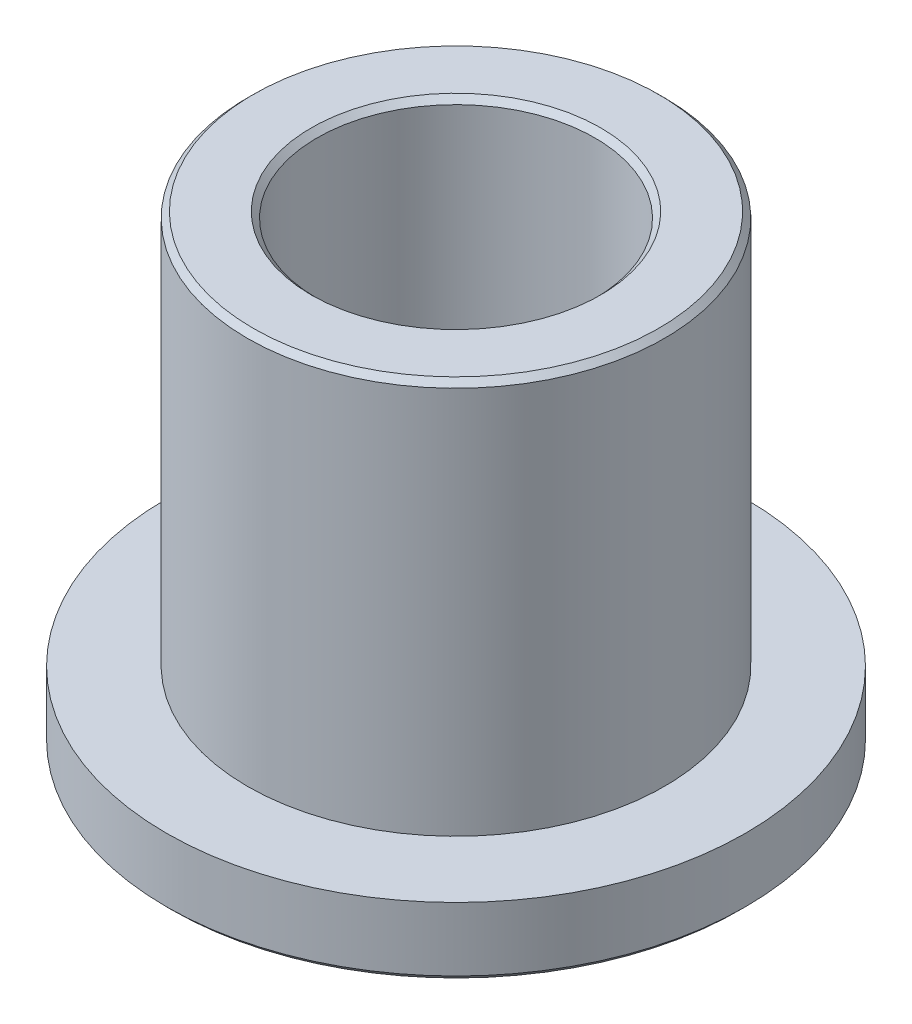
ISO-10303-21;
HEADER;
FILE_DESCRIPTION(('STEP AP214'),'2;1');
FILE_NAME('part.step','',(''),(''),'','','');
FILE_SCHEMA(('AUTOMOTIVE_DESIGN { 1 0 10303 214 1 1 1 1 }'));
ENDSEC;
DATA;
#1=APPLICATION_CONTEXT('core data for automotive mechanical design processes');
#2=APPLICATION_PROTOCOL_DEFINITION('international standard','automotive_design',2000,#1);
#3=PRODUCT_CONTEXT('',#1,'mechanical');
#4=PRODUCT('Part','Part','',(#3));
#5=PRODUCT_RELATED_PRODUCT_CATEGORY('part','',(#4));
#6=PRODUCT_DEFINITION_FORMATION('','',#4);
#7=PRODUCT_DEFINITION_CONTEXT('part definition',#1,'design');
#8=PRODUCT_DEFINITION('design','',#6,#7);
#9=PRODUCT_DEFINITION_SHAPE('','',#8);
#10=(LENGTH_UNIT() NAMED_UNIT(*) SI_UNIT(.MILLI.,.METRE.));
#11=(NAMED_UNIT(*) PLANE_ANGLE_UNIT() SI_UNIT($,.RADIAN.));
#12=(NAMED_UNIT(*) SI_UNIT($,.STERADIAN.) SOLID_ANGLE_UNIT());
#13=UNCERTAINTY_MEASURE_WITH_UNIT(LENGTH_MEASURE(1.E-05),#10,'distance_accuracy_value','');
#14=(GEOMETRIC_REPRESENTATION_CONTEXT(3) GLOBAL_UNCERTAINTY_ASSIGNED_CONTEXT((#13)) GLOBAL_UNIT_ASSIGNED_CONTEXT((#10,
#11,#12)) REPRESENTATION_CONTEXT('',''));
#15=CARTESIAN_POINT('',(0.,0.,0.));
#16=DIRECTION('',(0.,0.,1.));
#17=DIRECTION('',(1.,0.,0.));
#18=AXIS2_PLACEMENT_3D('',#15,#16,#17);
#19=CARTESIAN_POINT('',(0.,3.,0.));
#20=DIRECTION('',(0.,1.,0.));
#21=DIRECTION('',(0.,0.,1.));
#22=AXIS2_PLACEMENT_3D('',#19,#20,#21);
#23=PLANE('',#22);
#24=CARTESIAN_POINT('',(0.,3.,0.));
#25=DIRECTION('',(0.,1.,0.));
#26=DIRECTION('',(0.,0.,1.));
#27=AXIS2_PLACEMENT_3D('',#24,#25,#26);
#28=CIRCLE('',#27,12.5);
#29=CARTESIAN_POINT('',(0.,3.,12.5));
#30=VERTEX_POINT('',#29);
#31=EDGE_CURVE('E83',#30,#30,#28,.T.);
#32=ORIENTED_EDGE('',*,*,#31,.T.);
#33=EDGE_LOOP('',(#32));
#34=FACE_BOUND('',#33,.T.);
#35=CARTESIAN_POINT('',(0.,3.,0.));
#36=DIRECTION('',(0.,1.,0.));
#37=DIRECTION('',(0.,0.,1.));
#38=AXIS2_PLACEMENT_3D('',#35,#36,#37);
#39=CIRCLE('',#38,9.);
#40=CARTESIAN_POINT('',(0.,3.,9.));
#41=VERTEX_POINT('',#40);
#42=EDGE_CURVE('E87',#41,#41,#39,.T.);
#43=ORIENTED_EDGE('',*,*,#42,.F.);
#44=EDGE_LOOP('',(#43));
#45=FACE_BOUND('',#44,.T.);
#46=ADVANCED_FACE('F40',(#34,#45),#23,.T.);
#47=CARTESIAN_POINT('',(0.,0.,0.));
#48=DIRECTION('',(0.,1.,0.));
#49=DIRECTION('',(0.,0.,1.));
#50=AXIS2_PLACEMENT_3D('',#47,#48,#49);
#51=PLANE('',#50);
#52=CARTESIAN_POINT('',(0.,0.,0.));
#53=DIRECTION('',(0.,1.,0.));
#54=DIRECTION('',(0.,0.,1.));
#55=AXIS2_PLACEMENT_3D('',#52,#53,#54);
#56=CIRCLE('',#55,6.25);
#57=CARTESIAN_POINT('',(0.,0.,6.25));
#58=VERTEX_POINT('',#57);
#59=EDGE_CURVE('E75',#58,#58,#56,.T.);
#60=ORIENTED_EDGE('',*,*,#59,.T.);
#61=EDGE_LOOP('',(#60));
#62=FACE_BOUND('',#61,.T.);
#63=CARTESIAN_POINT('',(0.,0.,0.));
#64=DIRECTION('',(0.,1.,0.));
#65=DIRECTION('',(0.,0.,1.));
#66=AXIS2_PLACEMENT_3D('',#63,#64,#65);
#67=CIRCLE('',#66,12.25);
#68=CARTESIAN_POINT('',(0.,0.,12.25));
#69=VERTEX_POINT('',#68);
#70=EDGE_CURVE('E79',#69,#69,#67,.F.);
#71=ORIENTED_EDGE('',*,*,#70,.T.);
#72=EDGE_LOOP('',(#71));
#73=FACE_BOUND('',#72,.T.);
#74=ADVANCED_FACE('F96',(#62,#73),#51,.F.);
#75=CARTESIAN_POINT('',(0.,3.,0.));
#76=DIRECTION('',(0.,-1.,0.));
#77=DIRECTION('',(0.,0.,-1.));
#78=AXIS2_PLACEMENT_3D('',#75,#76,#77);
#79=CYLINDRICAL_SURFACE('',#78,12.5);
#80=CARTESIAN_POINT('',(0.,0.250000000000002,0.));
#81=DIRECTION('',(0.,1.,0.));
#82=DIRECTION('',(0.,0.,1.));
#83=AXIS2_PLACEMENT_3D('',#80,#81,#82);
#84=CIRCLE('',#83,12.5);
#85=CARTESIAN_POINT('',(0.,0.250000000000002,12.5));
#86=VERTEX_POINT('',#85);
#87=EDGE_CURVE('E61',#86,#86,#84,.T.);
#88=ORIENTED_EDGE('',*,*,#87,.T.);
#89=EDGE_LOOP('',(#88));
#90=FACE_BOUND('',#89,.T.);
#91=ORIENTED_EDGE('',*,*,#31,.F.);
#92=EDGE_LOOP('',(#91));
#93=FACE_BOUND('',#92,.T.);
#94=ADVANCED_FACE('F102',(#90,#93),#79,.T.);
#95=CARTESIAN_POINT('',(0.,3.,0.));
#96=DIRECTION('',(0.,-1.,0.));
#97=DIRECTION('',(0.,0.,-1.));
#98=AXIS2_PLACEMENT_3D('',#95,#96,#97);
#99=CYLINDRICAL_SURFACE('',#98,6.);
#100=CARTESIAN_POINT('',(0.,0.25,0.));
#101=DIRECTION('',(0.,1.,0.));
#102=DIRECTION('',(0.,0.,1.));
#103=AXIS2_PLACEMENT_3D('',#100,#101,#102);
#104=CIRCLE('',#103,6.);
#105=CARTESIAN_POINT('',(0.,0.25,6.));
#106=VERTEX_POINT('',#105);
#107=EDGE_CURVE('E67',#106,#106,#104,.F.);
#108=ORIENTED_EDGE('',*,*,#107,.T.);
#109=EDGE_LOOP('',(#108));
#110=FACE_BOUND('',#109,.T.);
#111=CARTESIAN_POINT('',(0.,19.75,0.));
#112=DIRECTION('',(0.,1.,0.));
#113=DIRECTION('',(0.,0.,1.));
#114=AXIS2_PLACEMENT_3D('',#111,#112,#113);
#115=CIRCLE('',#114,6.);
#116=CARTESIAN_POINT('',(0.,19.75,6.));
#117=VERTEX_POINT('',#116);
#118=EDGE_CURVE('E71',#117,#117,#115,.T.);
#119=ORIENTED_EDGE('',*,*,#118,.T.);
#120=EDGE_LOOP('',(#119));
#121=FACE_BOUND('',#120,.T.);
#122=ADVANCED_FACE('F106',(#110,#121),#99,.F.);
#123=CARTESIAN_POINT('',(0.,20.,0.));
#124=DIRECTION('',(0.,1.,0.));
#125=DIRECTION('',(0.,0.,1.));
#126=AXIS2_PLACEMENT_3D('',#123,#124,#125);
#127=PLANE('',#126);
#128=CARTESIAN_POINT('',(0.,20.,0.));
#129=DIRECTION('',(0.,1.,0.));
#130=DIRECTION('',(0.,0.,1.));
#131=AXIS2_PLACEMENT_3D('',#128,#129,#130);
#132=CIRCLE('',#131,6.25);
#133=CARTESIAN_POINT('',(0.,20.,6.25));
#134=VERTEX_POINT('',#133);
#135=EDGE_CURVE('E49',#134,#134,#132,.F.);
#136=ORIENTED_EDGE('',*,*,#135,.T.);
#137=EDGE_LOOP('',(#136));
#138=FACE_BOUND('',#137,.T.);
#139=CARTESIAN_POINT('',(0.,20.,0.));
#140=DIRECTION('',(0.,1.,0.));
#141=DIRECTION('',(0.,0.,1.));
#142=AXIS2_PLACEMENT_3D('',#139,#140,#141);
#143=CIRCLE('',#142,8.75000000000001);
#144=CARTESIAN_POINT('',(0.,20.,8.75000000000001));
#145=VERTEX_POINT('',#144);
#146=EDGE_CURVE('E55',#145,#145,#143,.T.);
#147=ORIENTED_EDGE('',*,*,#146,.T.);
#148=EDGE_LOOP('',(#147));
#149=FACE_BOUND('',#148,.T.);
#150=ADVANCED_FACE('F139',(#138,#149),#127,.T.);
#151=CARTESIAN_POINT('',(0.,20.,0.));
#152=DIRECTION('',(0.,-1.,0.));
#153=DIRECTION('',(0.,0.,-1.));
#154=AXIS2_PLACEMENT_3D('',#151,#152,#153);
#155=CYLINDRICAL_SURFACE('',#154,9.);
#156=CARTESIAN_POINT('',(0.,19.75,0.));
#157=DIRECTION('',(0.,1.,0.));
#158=DIRECTION('',(0.,0.,1.));
#159=AXIS2_PLACEMENT_3D('',#156,#157,#158);
#160=CIRCLE('',#159,9.);
#161=CARTESIAN_POINT('',(0.,19.75,9.));
#162=VERTEX_POINT('',#161);
#163=EDGE_CURVE('E10',#162,#162,#160,.F.);
#164=ORIENTED_EDGE('',*,*,#163,.T.);
#165=EDGE_LOOP('',(#164));
#166=FACE_BOUND('',#165,.T.);
#167=ORIENTED_EDGE('',*,*,#42,.T.);
#168=EDGE_LOOP('',(#167));
#169=FACE_BOUND('',#168,.T.);
#170=ADVANCED_FACE('F93',(#166,#169),#155,.T.);
#171=CARTESIAN_POINT('',(0.,0.,0.));
#172=DIRECTION('',(0.,-1.,0.));
#173=DIRECTION('',(0.,0.,-1.));
#174=AXIS2_PLACEMENT_3D('',#171,#172,#173);
#175=CONICAL_SURFACE('',#174,6.25,0.78539816339745);
#176=ORIENTED_EDGE('',*,*,#107,.F.);
#177=EDGE_LOOP('',(#176));
#178=FACE_BOUND('',#177,.T.);
#179=ORIENTED_EDGE('',*,*,#59,.F.);
#180=EDGE_LOOP('',(#179));
#181=FACE_BOUND('',#180,.T.);
#182=ADVANCED_FACE('F113',(#178,#181),#175,.F.);
#183=CARTESIAN_POINT('',(0.,0.250000000000002,0.));
#184=DIRECTION('',(0.,1.,0.));
#185=DIRECTION('',(0.,0.,1.));
#186=AXIS2_PLACEMENT_3D('',#183,#184,#185);
#187=CONICAL_SURFACE('',#186,12.5,0.785398163397452);
#188=ORIENTED_EDGE('',*,*,#70,.F.);
#189=EDGE_LOOP('',(#188));
#190=FACE_BOUND('',#189,.T.);
#191=ORIENTED_EDGE('',*,*,#87,.F.);
#192=EDGE_LOOP('',(#191));
#193=FACE_BOUND('',#192,.T.);
#194=ADVANCED_FACE('F119',(#190,#193),#187,.T.);
#195=CARTESIAN_POINT('',(0.,19.75,0.));
#196=DIRECTION('',(0.,1.,0.));
#197=DIRECTION('',(0.,0.,1.));
#198=AXIS2_PLACEMENT_3D('',#195,#196,#197);
#199=CONICAL_SURFACE('',#198,6.,0.785398163397436);
#200=ORIENTED_EDGE('',*,*,#135,.F.);
#201=EDGE_LOOP('',(#200));
#202=FACE_BOUND('',#201,.T.);
#203=ORIENTED_EDGE('',*,*,#118,.F.);
#204=EDGE_LOOP('',(#203));
#205=FACE_BOUND('',#204,.T.);
#206=ADVANCED_FACE('F125',(#202,#205),#199,.F.);
#207=CARTESIAN_POINT('',(0.,20.,0.));
#208=DIRECTION('',(0.,-1.,0.));
#209=DIRECTION('',(0.,0.,-1.));
#210=AXIS2_PLACEMENT_3D('',#207,#208,#209);
#211=CONICAL_SURFACE('',#210,8.75000000000001,0.785398163397431);
#212=ORIENTED_EDGE('',*,*,#163,.F.);
#213=EDGE_LOOP('',(#212));
#214=FACE_BOUND('',#213,.T.);
#215=ORIENTED_EDGE('',*,*,#146,.F.);
#216=EDGE_LOOP('',(#215));
#217=FACE_BOUND('',#216,.T.);
#218=ADVANCED_FACE('F43',(#214,#217),#211,.T.);
#219=CLOSED_SHELL('',(#46,#74,#94,#122,#150,#170,#182,#194,#206,#218));
#220=MANIFOLD_SOLID_BREP('B2',#219);
#221=ADVANCED_BREP_SHAPE_REPRESENTATION('',(#18,#220),#14);
#222=SHAPE_DEFINITION_REPRESENTATION(#9,#221);
ENDSEC;
END-ISO-10303-21;
